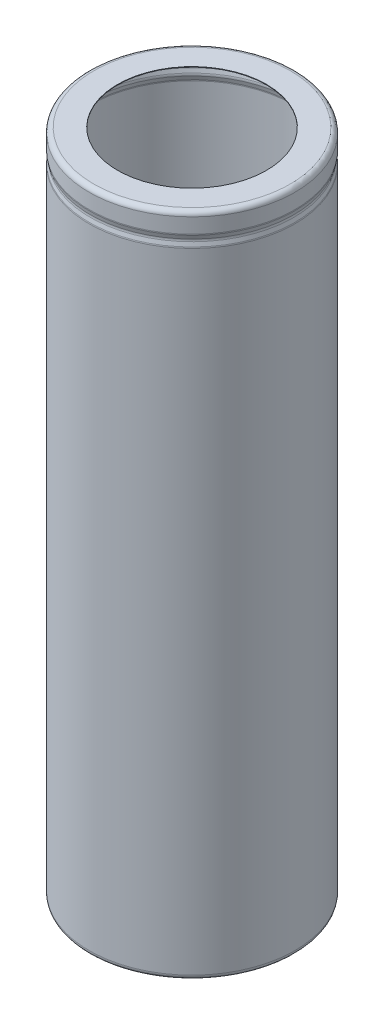
ISO-10303-21;
HEADER;
FILE_DESCRIPTION(('STEP AP214'),'2;1');
FILE_NAME('part.step','',(''),(''),'','','');
FILE_SCHEMA(('AUTOMOTIVE_DESIGN { 1 0 10303 214 1 1 1 1 }'));
ENDSEC;
DATA;
#1=APPLICATION_CONTEXT('core data for automotive mechanical design processes');
#2=APPLICATION_PROTOCOL_DEFINITION('international standard','automotive_design',2000,#1);
#3=PRODUCT_CONTEXT('',#1,'mechanical');
#4=PRODUCT('Part','Part','',(#3));
#5=PRODUCT_RELATED_PRODUCT_CATEGORY('part','',(#4));
#6=PRODUCT_DEFINITION_FORMATION('','',#4);
#7=PRODUCT_DEFINITION_CONTEXT('part definition',#1,'design');
#8=PRODUCT_DEFINITION('design','',#6,#7);
#9=PRODUCT_DEFINITION_SHAPE('','',#8);
#10=(LENGTH_UNIT() NAMED_UNIT(*) SI_UNIT(.MILLI.,.METRE.));
#11=(NAMED_UNIT(*) PLANE_ANGLE_UNIT() SI_UNIT($,.RADIAN.));
#12=(NAMED_UNIT(*) SI_UNIT($,.STERADIAN.) SOLID_ANGLE_UNIT());
#13=UNCERTAINTY_MEASURE_WITH_UNIT(LENGTH_MEASURE(1.E-05),#10,'distance_accuracy_value','');
#14=(GEOMETRIC_REPRESENTATION_CONTEXT(3) GLOBAL_UNCERTAINTY_ASSIGNED_CONTEXT((#13)) GLOBAL_UNIT_ASSIGNED_CONTEXT((#10,
#11,#12)) REPRESENTATION_CONTEXT('',''));
#15=CARTESIAN_POINT('',(0.,0.,0.));
#16=DIRECTION('',(0.,0.,1.));
#17=DIRECTION('',(1.,0.,0.));
#18=AXIS2_PLACEMENT_3D('',#15,#16,#17);
#19=CARTESIAN_POINT('',(0.,0.499999999999999,0.));
#20=DIRECTION('',(0.,-1.,0.));
#21=DIRECTION('',(0.,0.,-1.));
#22=AXIS2_PLACEMENT_3D('',#19,#20,#21);
#23=TOROIDAL_SURFACE('',#22,10.35,0.5);
#24=CARTESIAN_POINT('',(0.,0.500000000000003,0.));
#25=DIRECTION('',(0.,-1.,0.));
#26=DIRECTION('',(0.,0.,-1.));
#27=AXIS2_PLACEMENT_3D('',#24,#25,#26);
#28=CIRCLE('',#27,10.85);
#29=CARTESIAN_POINT('',(0.,0.500000000000003,-10.85));
#30=VERTEX_POINT('',#29);
#31=EDGE_CURVE('E10',#30,#30,#28,.T.);
#32=ORIENTED_EDGE('',*,*,#31,.T.);
#33=EDGE_LOOP('',(#32));
#34=FACE_BOUND('',#33,.T.);
#35=CARTESIAN_POINT('',(0.,0.,0.));
#36=DIRECTION('',(0.,-1.,0.));
#37=DIRECTION('',(0.,0.,-1.));
#38=AXIS2_PLACEMENT_3D('',#35,#36,#37);
#39=CIRCLE('',#38,10.35);
#40=CARTESIAN_POINT('',(0.,0.,-10.35));
#41=VERTEX_POINT('',#40);
#42=EDGE_CURVE('E114',#41,#41,#39,.T.);
#43=ORIENTED_EDGE('',*,*,#42,.F.);
#44=EDGE_LOOP('',(#43));
#45=FACE_BOUND('',#44,.T.);
#46=ADVANCED_FACE('F38',(#34,#45),#23,.T.);
#47=CARTESIAN_POINT('',(0.,0.,0.));
#48=DIRECTION('',(0.,-1.,0.));
#49=DIRECTION('',(0.,0.,-1.));
#50=AXIS2_PLACEMENT_3D('',#47,#48,#49);
#51=CYLINDRICAL_SURFACE('',#50,10.85);
#52=CARTESIAN_POINT('',(0.,66.8210521478381,0.));
#53=DIRECTION('',(0.,-1.,0.));
#54=DIRECTION('',(0.,0.,-1.));
#55=AXIS2_PLACEMENT_3D('',#52,#53,#54);
#56=CIRCLE('',#55,10.85);
#57=CARTESIAN_POINT('',(0.,66.8210521478381,-10.85));
#58=VERTEX_POINT('',#57);
#59=EDGE_CURVE('E44',#58,#58,#56,.T.);
#60=ORIENTED_EDGE('',*,*,#59,.T.);
#61=EDGE_LOOP('',(#60));
#62=FACE_BOUND('',#61,.T.);
#63=ORIENTED_EDGE('',*,*,#31,.F.);
#64=EDGE_LOOP('',(#63));
#65=FACE_BOUND('',#64,.T.);
#66=ADVANCED_FACE('F122',(#62,#65),#51,.T.);
#67=CARTESIAN_POINT('',(0.,66.8210521478381,0.));
#68=DIRECTION('',(0.,-1.,0.));
#69=DIRECTION('',(0.,0.,-1.));
#70=AXIS2_PLACEMENT_3D('',#67,#68,#69);
#71=TOROIDAL_SURFACE('',#70,10.35,0.499999999999998);
#72=CARTESIAN_POINT('',(0.,66.9444661525,0.));
#73=DIRECTION('',(0.,-1.,0.));
#74=DIRECTION('',(0.,0.,-1.));
#75=AXIS2_PLACEMENT_3D('',#72,#73,#74);
#76=CIRCLE('',#75,10.8345296517792);
#77=CARTESIAN_POINT('',(0.,66.9444661525,-10.8345296517792));
#78=VERTEX_POINT('',#77);
#79=EDGE_CURVE('E48',#78,#78,#76,.T.);
#80=ORIENTED_EDGE('',*,*,#79,.T.);
#81=EDGE_LOOP('',(#80));
#82=FACE_BOUND('',#81,.T.);
#83=ORIENTED_EDGE('',*,*,#59,.F.);
#84=EDGE_LOOP('',(#83));
#85=FACE_BOUND('',#84,.T.);
#86=ADVANCED_FACE('F127',(#82,#85),#71,.T.);
#87=CARTESIAN_POINT('',(0.,66.9444661525,0.));
#88=DIRECTION('',(0.,-1.,0.));
#89=DIRECTION('',(0.,0.,-1.));
#90=AXIS2_PLACEMENT_3D('',#87,#88,#89);
#91=CONICAL_SURFACE('',#90,10.8345296517792,0.249405615772116);
#92=CARTESIAN_POINT('',(0.,67.349222394879,0.));
#93=DIRECTION('',(0.,-1.,0.));
#94=DIRECTION('',(0.,0.,-1.));
#95=AXIS2_PLACEMENT_3D('',#92,#93,#94);
#96=CIRCLE('',#95,10.7314346428351);
#97=CARTESIAN_POINT('',(0.,67.349222394879,-10.7314346428351));
#98=VERTEX_POINT('',#97);
#99=EDGE_CURVE('E52',#98,#98,#96,.T.);
#100=ORIENTED_EDGE('',*,*,#99,.T.);
#101=EDGE_LOOP('',(#100));
#102=FACE_BOUND('',#101,.T.);
#103=ORIENTED_EDGE('',*,*,#79,.F.);
#104=EDGE_LOOP('',(#103));
#105=FACE_BOUND('',#104,.T.);
#106=ADVANCED_FACE('F132',(#102,#105),#91,.T.);
#107=CARTESIAN_POINT('',(0.,67.4726363995409,0.));
#108=DIRECTION('',(0.,-1.,0.));
#109=DIRECTION('',(0.,0.,-1.));
#110=AXIS2_PLACEMENT_3D('',#107,#108,#109);
#111=TOROIDAL_SURFACE('',#110,11.2159642946143,0.499999999999999);
#112=CARTESIAN_POINT('',(0.,67.5960504042028,0.));
#113=DIRECTION('',(0.,-1.,0.));
#114=DIRECTION('',(0.,0.,-1.));
#115=AXIS2_PLACEMENT_3D('',#112,#113,#114);
#116=CIRCLE('',#115,10.7314346428351);
#117=CARTESIAN_POINT('',(0.,67.5960504042028,-10.7314346428351));
#118=VERTEX_POINT('',#117);
#119=EDGE_CURVE('E57',#118,#118,#116,.T.);
#120=ORIENTED_EDGE('',*,*,#119,.T.);
#121=EDGE_LOOP('',(#120));
#122=FACE_BOUND('',#121,.T.);
#123=ORIENTED_EDGE('',*,*,#99,.F.);
#124=EDGE_LOOP('',(#123));
#125=FACE_BOUND('',#124,.T.);
#126=ADVANCED_FACE('F139',(#122,#125),#111,.F.);
#127=CARTESIAN_POINT('',(0.,67.5960504042028,0.));
#128=DIRECTION('',(0.,1.,0.));
#129=DIRECTION('',(0.,0.,1.));
#130=AXIS2_PLACEMENT_3D('',#127,#128,#129);
#131=CONICAL_SURFACE('',#130,10.7314346428351,0.249405615772116);
#132=CARTESIAN_POINT('',(0.,68.0008066465818,0.));
#133=DIRECTION('',(0.,-1.,0.));
#134=DIRECTION('',(0.,0.,-1.));
#135=AXIS2_PLACEMENT_3D('',#132,#133,#134);
#136=CIRCLE('',#135,10.8345296517792);
#137=CARTESIAN_POINT('',(0.,68.0008066465818,-10.8345296517792));
#138=VERTEX_POINT('',#137);
#139=EDGE_CURVE('E60',#138,#138,#136,.T.);
#140=ORIENTED_EDGE('',*,*,#139,.T.);
#141=EDGE_LOOP('',(#140));
#142=FACE_BOUND('',#141,.T.);
#143=ORIENTED_EDGE('',*,*,#119,.F.);
#144=EDGE_LOOP('',(#143));
#145=FACE_BOUND('',#144,.T.);
#146=ADVANCED_FACE('F143',(#142,#145),#131,.T.);
#147=CARTESIAN_POINT('',(0.,68.1242206512437,0.));
#148=DIRECTION('',(0.,-1.,0.));
#149=DIRECTION('',(0.,0.,-1.));
#150=AXIS2_PLACEMENT_3D('',#147,#148,#149);
#151=TOROIDAL_SURFACE('',#150,10.35,0.499999999999998);
#152=CARTESIAN_POINT('',(0.,68.1242206512437,0.));
#153=DIRECTION('',(0.,-1.,0.));
#154=DIRECTION('',(0.,0.,-1.));
#155=AXIS2_PLACEMENT_3D('',#152,#153,#154);
#156=CIRCLE('',#155,10.85);
#157=CARTESIAN_POINT('',(0.,68.1242206512437,-10.85));
#158=VERTEX_POINT('',#157);
#159=EDGE_CURVE('E63',#158,#158,#156,.T.);
#160=ORIENTED_EDGE('',*,*,#159,.T.);
#161=EDGE_LOOP('',(#160));
#162=FACE_BOUND('',#161,.T.);
#163=ORIENTED_EDGE('',*,*,#139,.F.);
#164=EDGE_LOOP('',(#163));
#165=FACE_BOUND('',#164,.T.);
#166=ADVANCED_FACE('F147',(#162,#165),#151,.T.);
#167=CARTESIAN_POINT('',(0.,0.,0.));
#168=DIRECTION('',(0.,-1.,0.));
#169=DIRECTION('',(0.,0.,-1.));
#170=AXIS2_PLACEMENT_3D('',#167,#168,#169);
#171=CYLINDRICAL_SURFACE('',#170,10.85);
#172=CARTESIAN_POINT('',(0.,69.7,0.));
#173=DIRECTION('',(0.,-1.,0.));
#174=DIRECTION('',(0.,0.,-1.));
#175=AXIS2_PLACEMENT_3D('',#172,#173,#174);
#176=CIRCLE('',#175,10.85);
#177=CARTESIAN_POINT('',(0.,69.7,-10.85));
#178=VERTEX_POINT('',#177);
#179=EDGE_CURVE('E66',#178,#178,#176,.T.);
#180=ORIENTED_EDGE('',*,*,#179,.T.);
#181=EDGE_LOOP('',(#180));
#182=FACE_BOUND('',#181,.T.);
#183=ORIENTED_EDGE('',*,*,#159,.F.);
#184=EDGE_LOOP('',(#183));
#185=FACE_BOUND('',#184,.T.);
#186=ADVANCED_FACE('F151',(#182,#185),#171,.T.);
#187=CARTESIAN_POINT('',(0.,69.7,0.));
#188=DIRECTION('',(0.,-1.,0.));
#189=DIRECTION('',(0.,0.,-1.));
#190=AXIS2_PLACEMENT_3D('',#187,#188,#189);
#191=TOROIDAL_SURFACE('',#190,10.35,0.5);
#192=CARTESIAN_POINT('',(0.,70.2,0.));
#193=DIRECTION('',(0.,-1.,0.));
#194=DIRECTION('',(0.,0.,-1.));
#195=AXIS2_PLACEMENT_3D('',#192,#193,#194);
#196=CIRCLE('',#195,10.35);
#197=CARTESIAN_POINT('',(0.,70.2,-10.35));
#198=VERTEX_POINT('',#197);
#199=EDGE_CURVE('E69',#198,#198,#196,.T.);
#200=ORIENTED_EDGE('',*,*,#199,.T.);
#201=EDGE_LOOP('',(#200));
#202=FACE_BOUND('',#201,.T.);
#203=ORIENTED_EDGE('',*,*,#179,.F.);
#204=EDGE_LOOP('',(#203));
#205=FACE_BOUND('',#204,.T.);
#206=ADVANCED_FACE('F155',(#202,#205),#191,.T.);
#207=CARTESIAN_POINT('',(7.85,70.2,0.));
#208=DIRECTION('',(0.,1.,0.));
#209=DIRECTION('',(0.,0.,1.));
#210=AXIS2_PLACEMENT_3D('',#207,#208,#209);
#211=PLANE('',#210);
#212=CARTESIAN_POINT('',(0.,70.2,0.));
#213=DIRECTION('',(0.,-1.,0.));
#214=DIRECTION('',(0.,0.,-1.));
#215=AXIS2_PLACEMENT_3D('',#212,#213,#214);
#216=CIRCLE('',#215,7.85);
#217=CARTESIAN_POINT('',(0.,70.2,-7.85));
#218=VERTEX_POINT('',#217);
#219=EDGE_CURVE('E72',#218,#218,#216,.T.);
#220=ORIENTED_EDGE('',*,*,#219,.T.);
#221=EDGE_LOOP('',(#220));
#222=FACE_BOUND('',#221,.T.);
#223=ORIENTED_EDGE('',*,*,#199,.F.);
#224=EDGE_LOOP('',(#223));
#225=FACE_BOUND('',#224,.T.);
#226=ADVANCED_FACE('F159',(#222,#225),#211,.T.);
#227=CARTESIAN_POINT('',(0.,0.,0.));
#228=DIRECTION('',(0.,-1.,0.));
#229=DIRECTION('',(0.,0.,-1.));
#230=AXIS2_PLACEMENT_3D('',#227,#228,#229);
#231=CYLINDRICAL_SURFACE('',#230,7.85);
#232=CARTESIAN_POINT('',(0.,70.15,0.));
#233=DIRECTION('',(0.,-1.,0.));
#234=DIRECTION('',(0.,0.,-1.));
#235=AXIS2_PLACEMENT_3D('',#232,#233,#234);
#236=CIRCLE('',#235,7.85);
#237=CARTESIAN_POINT('',(0.,70.15,-7.85));
#238=VERTEX_POINT('',#237);
#239=EDGE_CURVE('E75',#238,#238,#236,.T.);
#240=ORIENTED_EDGE('',*,*,#239,.T.);
#241=EDGE_LOOP('',(#240));
#242=FACE_BOUND('',#241,.T.);
#243=ORIENTED_EDGE('',*,*,#219,.F.);
#244=EDGE_LOOP('',(#243));
#245=FACE_BOUND('',#244,.T.);
#246=ADVANCED_FACE('F163',(#242,#245),#231,.F.);
#247=CARTESIAN_POINT('',(10.35,70.15,0.));
#248=DIRECTION('',(0.,-1.,0.));
#249=DIRECTION('',(0.,0.,-1.));
#250=AXIS2_PLACEMENT_3D('',#247,#248,#249);
#251=PLANE('',#250);
#252=CARTESIAN_POINT('',(0.,70.15,0.));
#253=DIRECTION('',(0.,-1.,0.));
#254=DIRECTION('',(0.,0.,-1.));
#255=AXIS2_PLACEMENT_3D('',#252,#253,#254);
#256=CIRCLE('',#255,10.35);
#257=CARTESIAN_POINT('',(0.,70.15,-10.35));
#258=VERTEX_POINT('',#257);
#259=EDGE_CURVE('E78',#258,#258,#256,.T.);
#260=ORIENTED_EDGE('',*,*,#259,.T.);
#261=EDGE_LOOP('',(#260));
#262=FACE_BOUND('',#261,.T.);
#263=ORIENTED_EDGE('',*,*,#239,.F.);
#264=EDGE_LOOP('',(#263));
#265=FACE_BOUND('',#264,.T.);
#266=ADVANCED_FACE('F167',(#262,#265),#251,.T.);
#267=CARTESIAN_POINT('',(0.,69.7,0.));
#268=DIRECTION('',(0.,-1.,0.));
#269=DIRECTION('',(0.,0.,-1.));
#270=AXIS2_PLACEMENT_3D('',#267,#268,#269);
#271=TOROIDAL_SURFACE('',#270,10.35,0.450000000000003);
#272=CARTESIAN_POINT('',(0.,69.7,0.));
#273=DIRECTION('',(0.,-1.,0.));
#274=DIRECTION('',(0.,0.,-1.));
#275=AXIS2_PLACEMENT_3D('',#272,#273,#274);
#276=CIRCLE('',#275,10.8);
#277=CARTESIAN_POINT('',(0.,69.7,-10.8));
#278=VERTEX_POINT('',#277);
#279=EDGE_CURVE('E81',#278,#278,#276,.T.);
#280=ORIENTED_EDGE('',*,*,#279,.T.);
#281=EDGE_LOOP('',(#280));
#282=FACE_BOUND('',#281,.T.);
#283=ORIENTED_EDGE('',*,*,#259,.F.);
#284=EDGE_LOOP('',(#283));
#285=FACE_BOUND('',#284,.T.);
#286=ADVANCED_FACE('F171',(#282,#285),#271,.F.);
#287=CARTESIAN_POINT('',(0.,0.,0.));
#288=DIRECTION('',(0.,-1.,0.));
#289=DIRECTION('',(0.,0.,-1.));
#290=AXIS2_PLACEMENT_3D('',#287,#288,#289);
#291=CYLINDRICAL_SURFACE('',#290,10.8);
#292=CARTESIAN_POINT('',(0.,68.1242206512437,0.));
#293=DIRECTION('',(0.,-1.,0.));
#294=DIRECTION('',(0.,0.,-1.));
#295=AXIS2_PLACEMENT_3D('',#292,#293,#294);
#296=CIRCLE('',#295,10.8);
#297=CARTESIAN_POINT('',(0.,68.1242206512437,-10.8));
#298=VERTEX_POINT('',#297);
#299=EDGE_CURVE('E84',#298,#298,#296,.T.);
#300=ORIENTED_EDGE('',*,*,#299,.T.);
#301=EDGE_LOOP('',(#300));
#302=FACE_BOUND('',#301,.T.);
#303=ORIENTED_EDGE('',*,*,#279,.F.);
#304=EDGE_LOOP('',(#303));
#305=FACE_BOUND('',#304,.T.);
#306=ADVANCED_FACE('F175',(#302,#305),#291,.F.);
#307=CARTESIAN_POINT('',(0.,68.1242206512437,0.));
#308=DIRECTION('',(0.,-1.,0.));
#309=DIRECTION('',(0.,0.,-1.));
#310=AXIS2_PLACEMENT_3D('',#307,#308,#309);
#311=TOROIDAL_SURFACE('',#310,10.35,0.45);
#312=CARTESIAN_POINT('',(0.,68.013148047048,0.));
#313=DIRECTION('',(0.,-1.,0.));
#314=DIRECTION('',(0.,0.,-1.));
#315=AXIS2_PLACEMENT_3D('',#312,#313,#314);
#316=CIRCLE('',#315,10.7860766866013);
#317=CARTESIAN_POINT('',(0.,68.013148047048,-10.7860766866013));
#318=VERTEX_POINT('',#317);
#319=EDGE_CURVE('E87',#318,#318,#316,.T.);
#320=ORIENTED_EDGE('',*,*,#319,.T.);
#321=EDGE_LOOP('',(#320));
#322=FACE_BOUND('',#321,.T.);
#323=ORIENTED_EDGE('',*,*,#299,.F.);
#324=EDGE_LOOP('',(#323));
#325=FACE_BOUND('',#324,.T.);
#326=ADVANCED_FACE('F179',(#322,#325),#311,.F.);
#327=CARTESIAN_POINT('',(0.,68.013148047048,0.));
#328=DIRECTION('',(0.,1.,0.));
#329=DIRECTION('',(0.,0.,1.));
#330=AXIS2_PLACEMENT_3D('',#327,#328,#329);
#331=CONICAL_SURFACE('',#330,10.7860766866013,0.249405615772116);
#332=CARTESIAN_POINT('',(0.,67.608391804669,0.));
#333=DIRECTION('',(0.,-1.,0.));
#334=DIRECTION('',(0.,0.,-1.));
#335=AXIS2_PLACEMENT_3D('',#332,#333,#334);
#336=CIRCLE('',#335,10.6829816776572);
#337=CARTESIAN_POINT('',(0.,67.608391804669,-10.6829816776572));
#338=VERTEX_POINT('',#337);
#339=EDGE_CURVE('E90',#338,#338,#336,.T.);
#340=ORIENTED_EDGE('',*,*,#339,.T.);
#341=EDGE_LOOP('',(#340));
#342=FACE_BOUND('',#341,.T.);
#343=ORIENTED_EDGE('',*,*,#319,.F.);
#344=EDGE_LOOP('',(#343));
#345=FACE_BOUND('',#344,.T.);
#346=ADVANCED_FACE('F183',(#342,#345),#331,.F.);
#347=CARTESIAN_POINT('',(0.,67.4726363995409,0.));
#348=DIRECTION('',(0.,-1.,0.));
#349=DIRECTION('',(0.,0.,-1.));
#350=AXIS2_PLACEMENT_3D('',#347,#348,#349);
#351=TOROIDAL_SURFACE('',#350,11.2159642946143,0.549999999999997);
#352=CARTESIAN_POINT('',(0.,67.3368809944128,0.));
#353=DIRECTION('',(0.,-1.,0.));
#354=DIRECTION('',(0.,0.,-1.));
#355=AXIS2_PLACEMENT_3D('',#352,#353,#354);
#356=CIRCLE('',#355,10.6829816776572);
#357=CARTESIAN_POINT('',(0.,67.3368809944128,-10.6829816776572));
#358=VERTEX_POINT('',#357);
#359=EDGE_CURVE('E93',#358,#358,#356,.T.);
#360=ORIENTED_EDGE('',*,*,#359,.T.);
#361=EDGE_LOOP('',(#360));
#362=FACE_BOUND('',#361,.T.);
#363=ORIENTED_EDGE('',*,*,#339,.F.);
#364=EDGE_LOOP('',(#363));
#365=FACE_BOUND('',#364,.T.);
#366=ADVANCED_FACE('F187',(#362,#365),#351,.T.);
#367=CARTESIAN_POINT('',(0.,67.3368809944128,0.));
#368=DIRECTION('',(0.,-1.,0.));
#369=DIRECTION('',(0.,0.,-1.));
#370=AXIS2_PLACEMENT_3D('',#367,#368,#369);
#371=CONICAL_SURFACE('',#370,10.6829816776572,0.249405615772116);
#372=CARTESIAN_POINT('',(0.,66.9321247520338,0.));
#373=DIRECTION('',(0.,-1.,0.));
#374=DIRECTION('',(0.,0.,-1.));
#375=AXIS2_PLACEMENT_3D('',#372,#373,#374);
#376=CIRCLE('',#375,10.7860766866013);
#377=CARTESIAN_POINT('',(0.,66.9321247520338,-10.7860766866013));
#378=VERTEX_POINT('',#377);
#379=EDGE_CURVE('E96',#378,#378,#376,.T.);
#380=ORIENTED_EDGE('',*,*,#379,.T.);
#381=EDGE_LOOP('',(#380));
#382=FACE_BOUND('',#381,.T.);
#383=ORIENTED_EDGE('',*,*,#359,.F.);
#384=EDGE_LOOP('',(#383));
#385=FACE_BOUND('',#384,.T.);
#386=ADVANCED_FACE('F191',(#382,#385),#371,.F.);
#387=CARTESIAN_POINT('',(0.,66.8210521478381,0.));
#388=DIRECTION('',(0.,-1.,0.));
#389=DIRECTION('',(0.,0.,-1.));
#390=AXIS2_PLACEMENT_3D('',#387,#388,#389);
#391=TOROIDAL_SURFACE('',#390,10.35,0.449999999999999);
#392=CARTESIAN_POINT('',(0.,66.8210521478381,0.));
#393=DIRECTION('',(0.,-1.,0.));
#394=DIRECTION('',(0.,0.,-1.));
#395=AXIS2_PLACEMENT_3D('',#392,#393,#394);
#396=CIRCLE('',#395,10.8);
#397=CARTESIAN_POINT('',(0.,66.8210521478381,-10.8));
#398=VERTEX_POINT('',#397);
#399=EDGE_CURVE('E99',#398,#398,#396,.T.);
#400=ORIENTED_EDGE('',*,*,#399,.T.);
#401=EDGE_LOOP('',(#400));
#402=FACE_BOUND('',#401,.T.);
#403=ORIENTED_EDGE('',*,*,#379,.F.);
#404=EDGE_LOOP('',(#403));
#405=FACE_BOUND('',#404,.T.);
#406=ADVANCED_FACE('F195',(#402,#405),#391,.F.);
#407=CARTESIAN_POINT('',(0.,0.,0.));
#408=DIRECTION('',(0.,-1.,0.));
#409=DIRECTION('',(0.,0.,-1.));
#410=AXIS2_PLACEMENT_3D('',#407,#408,#409);
#411=CYLINDRICAL_SURFACE('',#410,10.8);
#412=CARTESIAN_POINT('',(0.,0.499999999999999,0.));
#413=DIRECTION('',(0.,-1.,0.));
#414=DIRECTION('',(0.,0.,-1.));
#415=AXIS2_PLACEMENT_3D('',#412,#413,#414);
#416=CIRCLE('',#415,10.8);
#417=CARTESIAN_POINT('',(0.,0.499999999999999,-10.8));
#418=VERTEX_POINT('',#417);
#419=EDGE_CURVE('E102',#418,#418,#416,.T.);
#420=ORIENTED_EDGE('',*,*,#419,.T.);
#421=EDGE_LOOP('',(#420));
#422=FACE_BOUND('',#421,.T.);
#423=ORIENTED_EDGE('',*,*,#399,.F.);
#424=EDGE_LOOP('',(#423));
#425=FACE_BOUND('',#424,.T.);
#426=ADVANCED_FACE('F199',(#422,#425),#411,.F.);
#427=CARTESIAN_POINT('',(0.,0.499999999999999,0.));
#428=DIRECTION('',(0.,-1.,0.));
#429=DIRECTION('',(0.,0.,-1.));
#430=AXIS2_PLACEMENT_3D('',#427,#428,#429);
#431=TOROIDAL_SURFACE('',#430,10.35,0.449999999999996);
#432=CARTESIAN_POINT('',(0.,0.0499999999999992,0.));
#433=DIRECTION('',(0.,-1.,0.));
#434=DIRECTION('',(0.,0.,-1.));
#435=AXIS2_PLACEMENT_3D('',#432,#433,#434);
#436=CIRCLE('',#435,10.35);
#437=CARTESIAN_POINT('',(0.,0.0499999999999992,-10.35));
#438=VERTEX_POINT('',#437);
#439=EDGE_CURVE('E105',#438,#438,#436,.T.);
#440=ORIENTED_EDGE('',*,*,#439,.T.);
#441=EDGE_LOOP('',(#440));
#442=FACE_BOUND('',#441,.T.);
#443=ORIENTED_EDGE('',*,*,#419,.F.);
#444=EDGE_LOOP('',(#443));
#445=FACE_BOUND('',#444,.T.);
#446=ADVANCED_FACE('F203',(#442,#445),#431,.F.);
#447=CARTESIAN_POINT('',(10.35,0.0499999999999981,0.));
#448=DIRECTION('',(0.,1.,0.));
#449=DIRECTION('',(0.,0.,1.));
#450=AXIS2_PLACEMENT_3D('',#447,#448,#449);
#451=PLANE('',#450);
#452=CARTESIAN_POINT('',(0.,0.049999999999997,0.));
#453=DIRECTION('',(0.,-1.,0.));
#454=DIRECTION('',(0.,0.,-1.));
#455=AXIS2_PLACEMENT_3D('',#452,#453,#454);
#456=CIRCLE('',#455,8.5);
#457=CARTESIAN_POINT('',(0.,0.049999999999997,-8.5));
#458=VERTEX_POINT('',#457);
#459=EDGE_CURVE('E108',#458,#458,#456,.T.);
#460=ORIENTED_EDGE('',*,*,#459,.T.);
#461=EDGE_LOOP('',(#460));
#462=FACE_BOUND('',#461,.T.);
#463=ORIENTED_EDGE('',*,*,#439,.F.);
#464=EDGE_LOOP('',(#463));
#465=FACE_BOUND('',#464,.T.);
#466=ADVANCED_FACE('F207',(#462,#465),#451,.T.);
#467=CARTESIAN_POINT('',(0.,0.,0.));
#468=DIRECTION('',(0.,-1.,0.));
#469=DIRECTION('',(0.,0.,-1.));
#470=AXIS2_PLACEMENT_3D('',#467,#468,#469);
#471=CYLINDRICAL_SURFACE('',#470,8.5);
#472=CARTESIAN_POINT('',(0.,0.,0.));
#473=DIRECTION('',(0.,-1.,0.));
#474=DIRECTION('',(0.,0.,-1.));
#475=AXIS2_PLACEMENT_3D('',#472,#473,#474);
#476=CIRCLE('',#475,8.5);
#477=CARTESIAN_POINT('',(0.,0.,-8.5));
#478=VERTEX_POINT('',#477);
#479=EDGE_CURVE('E111',#478,#478,#476,.T.);
#480=ORIENTED_EDGE('',*,*,#479,.T.);
#481=EDGE_LOOP('',(#480));
#482=FACE_BOUND('',#481,.T.);
#483=ORIENTED_EDGE('',*,*,#459,.F.);
#484=EDGE_LOOP('',(#483));
#485=FACE_BOUND('',#484,.T.);
#486=ADVANCED_FACE('F211',(#482,#485),#471,.F.);
#487=CARTESIAN_POINT('',(10.35,0.,0.));
#488=DIRECTION('',(0.,-1.,0.));
#489=DIRECTION('',(0.,0.,-1.));
#490=AXIS2_PLACEMENT_3D('',#487,#488,#489);
#491=PLANE('',#490);
#492=ORIENTED_EDGE('',*,*,#42,.T.);
#493=EDGE_LOOP('',(#492));
#494=FACE_BOUND('',#493,.T.);
#495=ORIENTED_EDGE('',*,*,#479,.F.);
#496=EDGE_LOOP('',(#495));
#497=FACE_BOUND('',#496,.T.);
#498=ADVANCED_FACE('F118',(#494,#497),#491,.T.);
#499=CLOSED_SHELL('',(#46,#66,#86,#106,#126,#146,#166,#186,#206,#226,#246,#266,#286,#306,#326,
#346,#366,#386,#406,#426,#446,#466,#486,#498));
#500=MANIFOLD_SOLID_BREP('B2',#499);
#501=ADVANCED_BREP_SHAPE_REPRESENTATION('',(#18,#500),#14);
#502=SHAPE_DEFINITION_REPRESENTATION(#9,#501);
ENDSEC;
END-ISO-10303-21;
